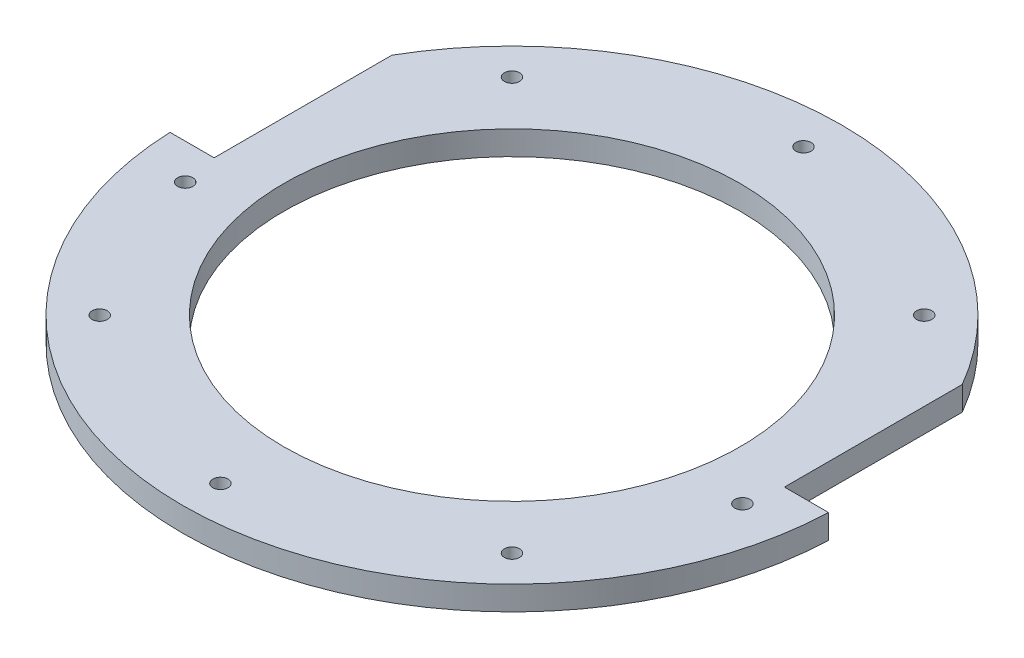
ISO-10303-21;
HEADER;
FILE_DESCRIPTION(('STEP AP214'),'2;1');
FILE_NAME('part.step','',(''),(''),'','','');
FILE_SCHEMA(('AUTOMOTIVE_DESIGN { 1 0 10303 214 1 1 1 1 }'));
ENDSEC;
DATA;
#1=APPLICATION_CONTEXT('core data for automotive mechanical design processes');
#2=APPLICATION_PROTOCOL_DEFINITION('international standard','automotive_design',2000,#1);
#3=PRODUCT_CONTEXT('',#1,'mechanical');
#4=PRODUCT('Part','Part','',(#3));
#5=PRODUCT_RELATED_PRODUCT_CATEGORY('part','',(#4));
#6=PRODUCT_DEFINITION_FORMATION('','',#4);
#7=PRODUCT_DEFINITION_CONTEXT('part definition',#1,'design');
#8=PRODUCT_DEFINITION('design','',#6,#7);
#9=PRODUCT_DEFINITION_SHAPE('','',#8);
#10=(LENGTH_UNIT() NAMED_UNIT(*) SI_UNIT(.MILLI.,.METRE.));
#11=(NAMED_UNIT(*) PLANE_ANGLE_UNIT() SI_UNIT($,.RADIAN.));
#12=(NAMED_UNIT(*) SI_UNIT($,.STERADIAN.) SOLID_ANGLE_UNIT());
#13=UNCERTAINTY_MEASURE_WITH_UNIT(LENGTH_MEASURE(1.E-05),#10,'distance_accuracy_value','');
#14=(GEOMETRIC_REPRESENTATION_CONTEXT(3) GLOBAL_UNCERTAINTY_ASSIGNED_CONTEXT((#13)) GLOBAL_UNIT_ASSIGNED_CONTEXT((#10,
#11,#12)) REPRESENTATION_CONTEXT('',''));
#15=CARTESIAN_POINT('',(0.,0.,0.));
#16=DIRECTION('',(0.,0.,1.));
#17=DIRECTION('',(1.,0.,0.));
#18=AXIS2_PLACEMENT_3D('',#15,#16,#17);
#19=CARTESIAN_POINT('',(0.,4.75,0.));
#20=DIRECTION('',(0.,1.,0.));
#21=DIRECTION('',(0.,0.,1.));
#22=AXIS2_PLACEMENT_3D('',#19,#20,#21);
#23=PLANE('',#22);
#24=CARTESIAN_POINT('',(54.951905283833,4.75,9.49999999999942));
#25=DIRECTION('',(0.,-1.,0.));
#26=DIRECTION('',(0.,0.,-1.));
#27=AXIS2_PLACEMENT_3D('',#24,#25,#26);
#28=CIRCLE('',#27,1.5);
#29=CARTESIAN_POINT('',(54.951905283833,4.75,7.99999999999941));
#30=VERTEX_POINT('',#29);
#31=EDGE_CURVE('E245',#30,#30,#28,.T.);
#32=ORIENTED_EDGE('',*,*,#31,.T.);
#33=EDGE_LOOP('',(#32));
#34=FACE_BOUND('',#33,.T.);
#35=CARTESIAN_POINT('',(-54.951905283833,4.75,9.49999999999942));
#36=DIRECTION('',(0.,-1.,0.));
#37=DIRECTION('',(0.,0.,1.));
#38=AXIS2_PLACEMENT_3D('',#35,#36,#37);
#39=CIRCLE('',#38,1.5);
#40=CARTESIAN_POINT('',(-54.951905283833,4.75,10.9999999999994));
#41=VERTEX_POINT('',#40);
#42=EDGE_CURVE('E249',#41,#41,#39,.T.);
#43=ORIENTED_EDGE('',*,*,#42,.T.);
#44=EDGE_LOOP('',(#43));
#45=FACE_BOUND('',#44,.T.);
#46=CARTESIAN_POINT('',(0.,4.75,0.));
#47=DIRECTION('',(0.,1.,0.));
#48=DIRECTION('',(0.,0.,1.));
#49=AXIS2_PLACEMENT_3D('',#46,#47,#48);
#50=CIRCLE('',#49,65.);
#51=CARTESIAN_POINT('',(56.25,4.75,-32.5720355519885));
#52=VERTEX_POINT('',#51);
#53=CARTESIAN_POINT('',(-56.25,4.75,-32.5720355519885));
#54=VERTEX_POINT('',#53);
#55=EDGE_CURVE('E126',#52,#54,#50,.T.);
#56=ORIENTED_EDGE('',*,*,#55,.T.);
#57=DIRECTION('',(0.,0.,-1.));
#58=VECTOR('',#57,1.);
#59=CARTESIAN_POINT('',(-56.25,4.75,-2.5));
#60=LINE('',#59,#58);
#61=CARTESIAN_POINT('',(-56.25,4.75,2.5));
#62=VERTEX_POINT('',#61);
#63=EDGE_CURVE('E113',#62,#54,#60,.T.);
#64=ORIENTED_EDGE('',*,*,#63,.F.);
#65=DIRECTION('',(1.,0.,0.));
#66=VECTOR('',#65,1.);
#67=CARTESIAN_POINT('',(-66.25,4.75,2.5));
#68=LINE('',#67,#66);
#69=CARTESIAN_POINT('',(-64.9519052838329,4.75,2.5));
#70=VERTEX_POINT('',#69);
#71=EDGE_CURVE('E328',#70,#62,#68,.T.);
#72=ORIENTED_EDGE('',*,*,#71,.F.);
#73=CARTESIAN_POINT('',(64.9519052838329,4.75,2.49999999999955));
#74=VERTEX_POINT('',#73);
#75=EDGE_CURVE('E122',#70,#74,#50,.T.);
#76=ORIENTED_EDGE('',*,*,#75,.T.);
#77=DIRECTION('',(1.,0.,0.));
#78=VECTOR('',#77,1.);
#79=CARTESIAN_POINT('',(66.25,4.75,2.49999999999954));
#80=LINE('',#79,#78);
#81=CARTESIAN_POINT('',(56.25,4.75,2.49999999999961));
#82=VERTEX_POINT('',#81);
#83=EDGE_CURVE('E65',#82,#74,#80,.T.);
#84=ORIENTED_EDGE('',*,*,#83,.F.);
#85=DIRECTION('',(0.,0.,1.));
#86=VECTOR('',#85,1.);
#87=CARTESIAN_POINT('',(56.25,4.75,-2.50000000000039));
#88=LINE('',#87,#86);
#89=EDGE_CURVE('E142',#52,#82,#88,.T.);
#90=ORIENTED_EDGE('',*,*,#89,.F.);
#91=EDGE_LOOP('',(#56,#64,#72,#76,#84,#90));
#92=FACE_BOUND('',#91,.T.);
#93=CARTESIAN_POINT('',(-40.6586399182265,4.75,-40.6586399182265));
#94=DIRECTION('',(0.,1.,0.));
#95=DIRECTION('',(0.,0.,-1.));
#96=AXIS2_PLACEMENT_3D('',#93,#94,#95);
#97=CIRCLE('',#96,1.5);
#98=CARTESIAN_POINT('',(-40.6586399182265,4.75,-42.1586399182265));
#99=VERTEX_POINT('',#98);
#100=EDGE_CURVE('E177',#99,#99,#97,.T.);
#101=ORIENTED_EDGE('',*,*,#100,.F.);
#102=EDGE_LOOP('',(#101));
#103=FACE_BOUND('',#102,.T.);
#104=CARTESIAN_POINT('',(40.6586399182265,4.75,-40.6586399182265));
#105=DIRECTION('',(0.,1.,0.));
#106=DIRECTION('',(0.,0.,1.));
#107=AXIS2_PLACEMENT_3D('',#104,#105,#106);
#108=CIRCLE('',#107,1.5);
#109=CARTESIAN_POINT('',(40.6586399182265,4.75,-39.1586399182265));
#110=VERTEX_POINT('',#109);
#111=EDGE_CURVE('E187',#110,#110,#108,.T.);
#112=ORIENTED_EDGE('',*,*,#111,.F.);
#113=EDGE_LOOP('',(#112));
#114=FACE_BOUND('',#113,.T.);
#115=CARTESIAN_POINT('',(0.,4.75,0.));
#116=DIRECTION('',(0.,1.,0.));
#117=DIRECTION('',(0.,0.,1.));
#118=AXIS2_PLACEMENT_3D('',#115,#116,#117);
#119=CIRCLE('',#118,45.);
#120=CARTESIAN_POINT('',(0.,4.75,45.));
#121=VERTEX_POINT('',#120);
#122=EDGE_CURVE('E208',#121,#121,#119,.T.);
#123=ORIENTED_EDGE('',*,*,#122,.F.);
#124=EDGE_LOOP('',(#123));
#125=FACE_BOUND('',#124,.T.);
#126=CARTESIAN_POINT('',(0.,4.75,57.5));
#127=DIRECTION('',(0.,1.,0.));
#128=DIRECTION('',(0.,0.,1.));
#129=AXIS2_PLACEMENT_3D('',#126,#127,#128);
#130=CIRCLE('',#129,1.5);
#131=CARTESIAN_POINT('',(0.,4.75,59.));
#132=VERTEX_POINT('',#131);
#133=EDGE_CURVE('E129',#132,#132,#130,.T.);
#134=ORIENTED_EDGE('',*,*,#133,.F.);
#135=EDGE_LOOP('',(#134));
#136=FACE_BOUND('',#135,.T.);
#137=CARTESIAN_POINT('',(40.6586399182265,4.75,40.6586399182265));
#138=DIRECTION('',(0.,1.,0.));
#139=DIRECTION('',(0.,0.,1.));
#140=AXIS2_PLACEMENT_3D('',#137,#138,#139);
#141=CIRCLE('',#140,1.5);
#142=CARTESIAN_POINT('',(40.6586399182265,4.75,42.1586399182265));
#143=VERTEX_POINT('',#142);
#144=EDGE_CURVE('E197',#143,#143,#141,.T.);
#145=ORIENTED_EDGE('',*,*,#144,.F.);
#146=EDGE_LOOP('',(#145));
#147=FACE_BOUND('',#146,.T.);
#148=CARTESIAN_POINT('',(0.,4.75,-57.5));
#149=DIRECTION('',(0.,1.,0.));
#150=DIRECTION('',(0.,0.,-1.));
#151=AXIS2_PLACEMENT_3D('',#148,#149,#150);
#152=CIRCLE('',#151,1.5);
#153=CARTESIAN_POINT('',(0.,4.75,-59.));
#154=VERTEX_POINT('',#153);
#155=EDGE_CURVE('E196',#154,#154,#152,.T.);
#156=ORIENTED_EDGE('',*,*,#155,.F.);
#157=EDGE_LOOP('',(#156));
#158=FACE_BOUND('',#157,.T.);
#159=CARTESIAN_POINT('',(-40.6586399182265,4.75,40.6586399182265));
#160=DIRECTION('',(0.,1.,0.));
#161=DIRECTION('',(0.,0.,-1.));
#162=AXIS2_PLACEMENT_3D('',#159,#160,#161);
#163=CIRCLE('',#162,1.5);
#164=CARTESIAN_POINT('',(-40.6586399182265,4.75,39.1586399182265));
#165=VERTEX_POINT('',#164);
#166=EDGE_CURVE('E168',#165,#165,#163,.T.);
#167=ORIENTED_EDGE('',*,*,#166,.F.);
#168=EDGE_LOOP('',(#167));
#169=FACE_BOUND('',#168,.T.);
#170=ADVANCED_FACE('F50',(#34,#45,#92,#103,#114,#125,#136,#147,#158,#169),#23,.T.);
#171=CARTESIAN_POINT('',(0.,0.,0.));
#172=DIRECTION('',(0.,1.,0.));
#173=DIRECTION('',(0.,0.,1.));
#174=AXIS2_PLACEMENT_3D('',#171,#172,#173);
#175=PLANE('',#174);
#176=CARTESIAN_POINT('',(54.951905283833,0.,9.49999999999942));
#177=DIRECTION('',(0.,-1.,0.));
#178=DIRECTION('',(0.,0.,-1.));
#179=AXIS2_PLACEMENT_3D('',#176,#177,#178);
#180=CIRCLE('',#179,1.5);
#181=CARTESIAN_POINT('',(54.951905283833,0.,7.99999999999941));
#182=VERTEX_POINT('',#181);
#183=EDGE_CURVE('E319',#182,#182,#180,.T.);
#184=ORIENTED_EDGE('',*,*,#183,.F.);
#185=EDGE_LOOP('',(#184));
#186=FACE_BOUND('',#185,.T.);
#187=CARTESIAN_POINT('',(-54.951905283833,0.,9.49999999999942));
#188=DIRECTION('',(0.,-1.,0.));
#189=DIRECTION('',(0.,0.,1.));
#190=AXIS2_PLACEMENT_3D('',#187,#188,#189);
#191=CIRCLE('',#190,1.5);
#192=CARTESIAN_POINT('',(-54.951905283833,0.,10.9999999999994));
#193=VERTEX_POINT('',#192);
#194=EDGE_CURVE('E320',#193,#193,#191,.T.);
#195=ORIENTED_EDGE('',*,*,#194,.F.);
#196=EDGE_LOOP('',(#195));
#197=FACE_BOUND('',#196,.T.);
#198=CARTESIAN_POINT('',(-40.6586399182265,0.,40.6586399182265));
#199=DIRECTION('',(0.,1.,0.));
#200=DIRECTION('',(0.,0.,-1.));
#201=AXIS2_PLACEMENT_3D('',#198,#199,#200);
#202=CIRCLE('',#201,1.5);
#203=CARTESIAN_POINT('',(-40.6586399182265,0.,39.1586399182265));
#204=VERTEX_POINT('',#203);
#205=EDGE_CURVE('E174',#204,#204,#202,.T.);
#206=ORIENTED_EDGE('',*,*,#205,.T.);
#207=EDGE_LOOP('',(#206));
#208=FACE_BOUND('',#207,.T.);
#209=CARTESIAN_POINT('',(-40.6586399182265,0.,-40.6586399182265));
#210=DIRECTION('',(0.,1.,0.));
#211=DIRECTION('',(0.,0.,-1.));
#212=AXIS2_PLACEMENT_3D('',#209,#210,#211);
#213=CIRCLE('',#212,1.5);
#214=CARTESIAN_POINT('',(-40.6586399182265,0.,-42.1586399182265));
#215=VERTEX_POINT('',#214);
#216=EDGE_CURVE('E173',#215,#215,#213,.T.);
#217=ORIENTED_EDGE('',*,*,#216,.T.);
#218=EDGE_LOOP('',(#217));
#219=FACE_BOUND('',#218,.T.);
#220=CARTESIAN_POINT('',(0.,0.,-57.5));
#221=DIRECTION('',(0.,1.,0.));
#222=DIRECTION('',(0.,0.,-1.));
#223=AXIS2_PLACEMENT_3D('',#220,#221,#222);
#224=CIRCLE('',#223,1.5);
#225=CARTESIAN_POINT('',(0.,0.,-59.));
#226=VERTEX_POINT('',#225);
#227=EDGE_CURVE('E181',#226,#226,#224,.T.);
#228=ORIENTED_EDGE('',*,*,#227,.T.);
#229=EDGE_LOOP('',(#228));
#230=FACE_BOUND('',#229,.T.);
#231=CARTESIAN_POINT('',(40.6586399182265,0.,-40.6586399182265));
#232=DIRECTION('',(0.,1.,0.));
#233=DIRECTION('',(0.,0.,1.));
#234=AXIS2_PLACEMENT_3D('',#231,#232,#233);
#235=CIRCLE('',#234,1.5);
#236=CARTESIAN_POINT('',(40.6586399182265,0.,-39.1586399182265));
#237=VERTEX_POINT('',#236);
#238=EDGE_CURVE('E193',#237,#237,#235,.T.);
#239=ORIENTED_EDGE('',*,*,#238,.T.);
#240=EDGE_LOOP('',(#239));
#241=FACE_BOUND('',#240,.T.);
#242=CARTESIAN_POINT('',(40.6586399182265,0.,40.6586399182265));
#243=DIRECTION('',(0.,1.,0.));
#244=DIRECTION('',(0.,0.,1.));
#245=AXIS2_PLACEMENT_3D('',#242,#243,#244);
#246=CIRCLE('',#245,1.5);
#247=CARTESIAN_POINT('',(40.6586399182265,0.,42.1586399182265));
#248=VERTEX_POINT('',#247);
#249=EDGE_CURVE('E192',#248,#248,#246,.T.);
#250=ORIENTED_EDGE('',*,*,#249,.T.);
#251=EDGE_LOOP('',(#250));
#252=FACE_BOUND('',#251,.T.);
#253=CARTESIAN_POINT('',(0.,0.,0.));
#254=DIRECTION('',(0.,1.,0.));
#255=DIRECTION('',(0.,0.,1.));
#256=AXIS2_PLACEMENT_3D('',#253,#254,#255);
#257=CIRCLE('',#256,45.);
#258=CARTESIAN_POINT('',(0.,0.,45.));
#259=VERTEX_POINT('',#258);
#260=EDGE_CURVE('E201',#259,#259,#257,.T.);
#261=ORIENTED_EDGE('',*,*,#260,.T.);
#262=EDGE_LOOP('',(#261));
#263=FACE_BOUND('',#262,.T.);
#264=CARTESIAN_POINT('',(0.,0.,57.5));
#265=DIRECTION('',(0.,1.,0.));
#266=DIRECTION('',(0.,0.,1.));
#267=AXIS2_PLACEMENT_3D('',#264,#265,#266);
#268=CIRCLE('',#267,1.5);
#269=CARTESIAN_POINT('',(0.,0.,59.));
#270=VERTEX_POINT('',#269);
#271=EDGE_CURVE('E206',#270,#270,#268,.T.);
#272=ORIENTED_EDGE('',*,*,#271,.T.);
#273=EDGE_LOOP('',(#272));
#274=FACE_BOUND('',#273,.T.);
#275=DIRECTION('',(0.,0.,-1.));
#276=VECTOR('',#275,1.);
#277=CARTESIAN_POINT('',(-56.25,0.,0.));
#278=LINE('',#277,#276);
#279=CARTESIAN_POINT('',(-56.25,0.,2.5));
#280=VERTEX_POINT('',#279);
#281=CARTESIAN_POINT('',(-56.25,0.,-32.5720355519885));
#282=VERTEX_POINT('',#281);
#283=EDGE_CURVE('E13',#280,#282,#278,.T.);
#284=ORIENTED_EDGE('',*,*,#283,.T.);
#285=CARTESIAN_POINT('',(0.,0.,0.));
#286=DIRECTION('',(0.,1.,0.));
#287=DIRECTION('',(0.,0.,1.));
#288=AXIS2_PLACEMENT_3D('',#285,#286,#287);
#289=CIRCLE('',#288,65.);
#290=CARTESIAN_POINT('',(56.25,0.,-32.5720355519885));
#291=VERTEX_POINT('',#290);
#292=EDGE_CURVE('E106',#291,#282,#289,.T.);
#293=ORIENTED_EDGE('',*,*,#292,.F.);
#294=DIRECTION('',(0.,0.,1.));
#295=VECTOR('',#294,1.);
#296=CARTESIAN_POINT('',(56.25,0.,-4.68375338513738E-13));
#297=LINE('',#296,#295);
#298=CARTESIAN_POINT('',(56.25,0.,2.49999999999961));
#299=VERTEX_POINT('',#298);
#300=EDGE_CURVE('E58',#291,#299,#297,.T.);
#301=ORIENTED_EDGE('',*,*,#300,.T.);
#302=DIRECTION('',(1.,0.,0.));
#303=VECTOR('',#302,1.);
#304=CARTESIAN_POINT('',(0.,0.,2.5));
#305=LINE('',#304,#303);
#306=CARTESIAN_POINT('',(64.9519052838329,0.,2.49999999999955));
#307=VERTEX_POINT('',#306);
#308=EDGE_CURVE('E137',#299,#307,#305,.T.);
#309=ORIENTED_EDGE('',*,*,#308,.T.);
#310=CARTESIAN_POINT('',(-64.9519052838329,0.,2.5));
#311=VERTEX_POINT('',#310);
#312=EDGE_CURVE('E123',#311,#307,#289,.T.);
#313=ORIENTED_EDGE('',*,*,#312,.F.);
#314=DIRECTION('',(1.,0.,0.));
#315=VECTOR('',#314,1.);
#316=CARTESIAN_POINT('',(0.,0.,2.5));
#317=LINE('',#316,#315);
#318=EDGE_CURVE('E73',#311,#280,#317,.T.);
#319=ORIENTED_EDGE('',*,*,#318,.T.);
#320=EDGE_LOOP('',(#284,#293,#301,#309,#313,#319));
#321=FACE_BOUND('',#320,.T.);
#322=ADVANCED_FACE('F103',(#186,#197,#208,#219,#230,#241,#252,#263,#274,#321),#175,.F.);
#323=CARTESIAN_POINT('',(0.,4.75,0.));
#324=DIRECTION('',(0.,-1.,0.));
#325=DIRECTION('',(0.,0.,-1.));
#326=AXIS2_PLACEMENT_3D('',#323,#324,#325);
#327=CYLINDRICAL_SURFACE('',#326,65.);
#328=ORIENTED_EDGE('',*,*,#292,.T.);
#329=DIRECTION('',(0.,1.,0.));
#330=VECTOR('',#329,1.);
#331=CARTESIAN_POINT('',(-56.25,0.,-32.5720355519885));
#332=LINE('',#331,#330);
#333=EDGE_CURVE('E110',#282,#54,#332,.T.);
#334=ORIENTED_EDGE('',*,*,#333,.T.);
#335=ORIENTED_EDGE('',*,*,#55,.F.);
#336=DIRECTION('',(0.,1.,0.));
#337=VECTOR('',#336,1.);
#338=CARTESIAN_POINT('',(56.25,0.,-32.5720355519885));
#339=LINE('',#338,#337);
#340=EDGE_CURVE('E118',#291,#52,#339,.T.);
#341=ORIENTED_EDGE('',*,*,#340,.F.);
#342=EDGE_LOOP('',(#328,#334,#335,#341));
#343=FACE_BOUND('',#342,.T.);
#344=ADVANCED_FACE('F52',(#343),#327,.T.);
#345=ORIENTED_EDGE('',*,*,#75,.F.);
#346=DIRECTION('',(0.,-1.,0.));
#347=VECTOR('',#346,1.);
#348=CARTESIAN_POINT('',(-64.9519052838329,4.75,2.5));
#349=LINE('',#348,#347);
#350=EDGE_CURVE('E135',#70,#311,#349,.T.);
#351=ORIENTED_EDGE('',*,*,#350,.T.);
#352=ORIENTED_EDGE('',*,*,#312,.T.);
#353=DIRECTION('',(0.,-1.,0.));
#354=VECTOR('',#353,1.);
#355=CARTESIAN_POINT('',(64.9519052838329,4.75,2.49999999999955));
#356=LINE('',#355,#354);
#357=EDGE_CURVE('E133',#307,#74,#356,.F.);
#358=ORIENTED_EDGE('',*,*,#357,.T.);
#359=EDGE_LOOP('',(#345,#351,#352,#358));
#360=FACE_BOUND('',#359,.T.);
#361=ADVANCED_FACE('F231',(#360),#327,.T.);
#362=CARTESIAN_POINT('',(0.,4.75,57.5));
#363=DIRECTION('',(0.,-1.,0.));
#364=DIRECTION('',(0.,0.,-1.));
#365=AXIS2_PLACEMENT_3D('',#362,#363,#364);
#366=CYLINDRICAL_SURFACE('',#365,1.5);
#367=ORIENTED_EDGE('',*,*,#133,.T.);
#368=EDGE_LOOP('',(#367));
#369=FACE_BOUND('',#368,.T.);
#370=ORIENTED_EDGE('',*,*,#271,.F.);
#371=EDGE_LOOP('',(#370));
#372=FACE_BOUND('',#371,.T.);
#373=ADVANCED_FACE('F222',(#369,#372),#366,.F.);
#374=CARTESIAN_POINT('',(0.,4.75,0.));
#375=DIRECTION('',(0.,-1.,0.));
#376=DIRECTION('',(0.,0.,-1.));
#377=AXIS2_PLACEMENT_3D('',#374,#375,#376);
#378=CYLINDRICAL_SURFACE('',#377,45.);
#379=ORIENTED_EDGE('',*,*,#122,.T.);
#380=EDGE_LOOP('',(#379));
#381=FACE_BOUND('',#380,.T.);
#382=ORIENTED_EDGE('',*,*,#260,.F.);
#383=EDGE_LOOP('',(#382));
#384=FACE_BOUND('',#383,.T.);
#385=ADVANCED_FACE('F219',(#381,#384),#378,.F.);
#386=CARTESIAN_POINT('',(40.6586399182265,4.75,40.6586399182265));
#387=DIRECTION('',(0.,-1.,0.));
#388=DIRECTION('',(0.,0.,-1.));
#389=AXIS2_PLACEMENT_3D('',#386,#387,#388);
#390=CYLINDRICAL_SURFACE('',#389,1.5);
#391=ORIENTED_EDGE('',*,*,#144,.T.);
#392=EDGE_LOOP('',(#391));
#393=FACE_BOUND('',#392,.T.);
#394=ORIENTED_EDGE('',*,*,#249,.F.);
#395=EDGE_LOOP('',(#394));
#396=FACE_BOUND('',#395,.T.);
#397=ADVANCED_FACE('F221',(#393,#396),#390,.F.);
#398=CARTESIAN_POINT('',(40.6586399182265,4.75,-40.6586399182265));
#399=DIRECTION('',(0.,-1.,0.));
#400=DIRECTION('',(0.,0.,-1.));
#401=AXIS2_PLACEMENT_3D('',#398,#399,#400);
#402=CYLINDRICAL_SURFACE('',#401,1.5);
#403=ORIENTED_EDGE('',*,*,#111,.T.);
#404=EDGE_LOOP('',(#403));
#405=FACE_BOUND('',#404,.T.);
#406=ORIENTED_EDGE('',*,*,#238,.F.);
#407=EDGE_LOOP('',(#406));
#408=FACE_BOUND('',#407,.T.);
#409=ADVANCED_FACE('F228',(#405,#408),#402,.F.);
#410=CARTESIAN_POINT('',(0.,4.75,-57.5));
#411=DIRECTION('',(0.,-1.,0.));
#412=DIRECTION('',(0.,0.,-1.));
#413=AXIS2_PLACEMENT_3D('',#410,#411,#412);
#414=CYLINDRICAL_SURFACE('',#413,1.5);
#415=ORIENTED_EDGE('',*,*,#155,.T.);
#416=EDGE_LOOP('',(#415));
#417=FACE_BOUND('',#416,.T.);
#418=ORIENTED_EDGE('',*,*,#227,.F.);
#419=EDGE_LOOP('',(#418));
#420=FACE_BOUND('',#419,.T.);
#421=ADVANCED_FACE('F286',(#417,#420),#414,.F.);
#422=CARTESIAN_POINT('',(-40.6586399182265,4.75,-40.6586399182265));
#423=DIRECTION('',(0.,-1.,0.));
#424=DIRECTION('',(0.,0.,-1.));
#425=AXIS2_PLACEMENT_3D('',#422,#423,#424);
#426=CYLINDRICAL_SURFACE('',#425,1.5);
#427=ORIENTED_EDGE('',*,*,#100,.T.);
#428=EDGE_LOOP('',(#427));
#429=FACE_BOUND('',#428,.T.);
#430=ORIENTED_EDGE('',*,*,#216,.F.);
#431=EDGE_LOOP('',(#430));
#432=FACE_BOUND('',#431,.T.);
#433=ADVANCED_FACE('F268',(#429,#432),#426,.F.);
#434=CARTESIAN_POINT('',(-40.6586399182265,4.75,40.6586399182265));
#435=DIRECTION('',(0.,-1.,0.));
#436=DIRECTION('',(0.,0.,-1.));
#437=AXIS2_PLACEMENT_3D('',#434,#435,#436);
#438=CYLINDRICAL_SURFACE('',#437,1.5);
#439=ORIENTED_EDGE('',*,*,#166,.T.);
#440=EDGE_LOOP('',(#439));
#441=FACE_BOUND('',#440,.T.);
#442=ORIENTED_EDGE('',*,*,#205,.F.);
#443=EDGE_LOOP('',(#442));
#444=FACE_BOUND('',#443,.T.);
#445=ADVANCED_FACE('F265',(#441,#444),#438,.F.);
#446=CARTESIAN_POINT('',(56.25,-0.25,-2.50000000000039));
#447=DIRECTION('',(-1.,0.,0.));
#448=DIRECTION('',(0.,0.,1.));
#449=AXIS2_PLACEMENT_3D('',#446,#447,#448);
#450=PLANE('',#449);
#451=ORIENTED_EDGE('',*,*,#300,.F.);
#452=ORIENTED_EDGE('',*,*,#340,.T.);
#453=ORIENTED_EDGE('',*,*,#89,.T.);
#454=DIRECTION('',(0.,1.,0.));
#455=VECTOR('',#454,1.);
#456=CARTESIAN_POINT('',(56.25,-0.25,2.49999999999961));
#457=LINE('',#456,#455);
#458=EDGE_CURVE('E117',#299,#82,#457,.T.);
#459=ORIENTED_EDGE('',*,*,#458,.F.);
#460=EDGE_LOOP('',(#451,#452,#453,#459));
#461=FACE_BOUND('',#460,.T.);
#462=ADVANCED_FACE('F140',(#461),#450,.F.);
#463=CARTESIAN_POINT('',(66.25,-0.25,2.49999999999954));
#464=DIRECTION('',(0.,0.,1.));
#465=DIRECTION('',(1.,0.,0.));
#466=AXIS2_PLACEMENT_3D('',#463,#464,#465);
#467=PLANE('',#466);
#468=ORIENTED_EDGE('',*,*,#458,.T.);
#469=ORIENTED_EDGE('',*,*,#83,.T.);
#470=ORIENTED_EDGE('',*,*,#357,.F.);
#471=ORIENTED_EDGE('',*,*,#308,.F.);
#472=EDGE_LOOP('',(#468,#469,#470,#471));
#473=FACE_BOUND('',#472,.T.);
#474=ADVANCED_FACE('F298',(#473),#467,.F.);
#475=CARTESIAN_POINT('',(-56.25,-0.25,-2.5));
#476=DIRECTION('',(1.,0.,0.));
#477=DIRECTION('',(0.,0.,-1.));
#478=AXIS2_PLACEMENT_3D('',#475,#476,#477);
#479=PLANE('',#478);
#480=DIRECTION('',(0.,1.,0.));
#481=VECTOR('',#480,1.);
#482=CARTESIAN_POINT('',(-56.25,-0.25,2.5));
#483=LINE('',#482,#481);
#484=EDGE_CURVE('E146',#280,#62,#483,.T.);
#485=ORIENTED_EDGE('',*,*,#484,.T.);
#486=ORIENTED_EDGE('',*,*,#63,.T.);
#487=ORIENTED_EDGE('',*,*,#333,.F.);
#488=ORIENTED_EDGE('',*,*,#283,.F.);
#489=EDGE_LOOP('',(#485,#486,#487,#488));
#490=FACE_BOUND('',#489,.T.);
#491=ADVANCED_FACE('F111',(#490),#479,.F.);
#492=CARTESIAN_POINT('',(-66.25,-0.25,2.5));
#493=DIRECTION('',(0.,0.,1.));
#494=DIRECTION('',(1.,0.,0.));
#495=AXIS2_PLACEMENT_3D('',#492,#493,#494);
#496=PLANE('',#495);
#497=ORIENTED_EDGE('',*,*,#350,.F.);
#498=ORIENTED_EDGE('',*,*,#71,.T.);
#499=ORIENTED_EDGE('',*,*,#484,.F.);
#500=ORIENTED_EDGE('',*,*,#318,.F.);
#501=EDGE_LOOP('',(#497,#498,#499,#500));
#502=FACE_BOUND('',#501,.T.);
#503=ADVANCED_FACE('F304',(#502),#496,.F.);
#504=CARTESIAN_POINT('',(-54.951905283833,4.75,9.49999999999942));
#505=DIRECTION('',(0.,-1.,0.));
#506=DIRECTION('',(0.,0.,-1.));
#507=AXIS2_PLACEMENT_3D('',#504,#505,#506);
#508=CYLINDRICAL_SURFACE('',#507,1.5);
#509=ORIENTED_EDGE('',*,*,#42,.F.);
#510=EDGE_LOOP('',(#509));
#511=FACE_BOUND('',#510,.T.);
#512=ORIENTED_EDGE('',*,*,#194,.T.);
#513=EDGE_LOOP('',(#512));
#514=FACE_BOUND('',#513,.T.);
#515=ADVANCED_FACE('F307',(#511,#514),#508,.F.);
#516=CARTESIAN_POINT('',(54.951905283833,4.75,9.49999999999942));
#517=DIRECTION('',(0.,-1.,0.));
#518=DIRECTION('',(0.,0.,-1.));
#519=AXIS2_PLACEMENT_3D('',#516,#517,#518);
#520=CYLINDRICAL_SURFACE('',#519,1.5);
#521=ORIENTED_EDGE('',*,*,#31,.F.);
#522=EDGE_LOOP('',(#521));
#523=FACE_BOUND('',#522,.T.);
#524=ORIENTED_EDGE('',*,*,#183,.T.);
#525=EDGE_LOOP('',(#524));
#526=FACE_BOUND('',#525,.T.);
#527=ADVANCED_FACE('F310',(#523,#526),#520,.F.);
#528=CLOSED_SHELL('',(#170,#322,#344,#361,#373,#385,#397,#409,#421,#433,#445,#462,#474,#491,
#503,#515,#527));
#529=MANIFOLD_SOLID_BREP('B2',#528);
#530=ADVANCED_BREP_SHAPE_REPRESENTATION('',(#18,#529),#14);
#531=SHAPE_DEFINITION_REPRESENTATION(#9,#530);
ENDSEC;
END-ISO-10303-21;
